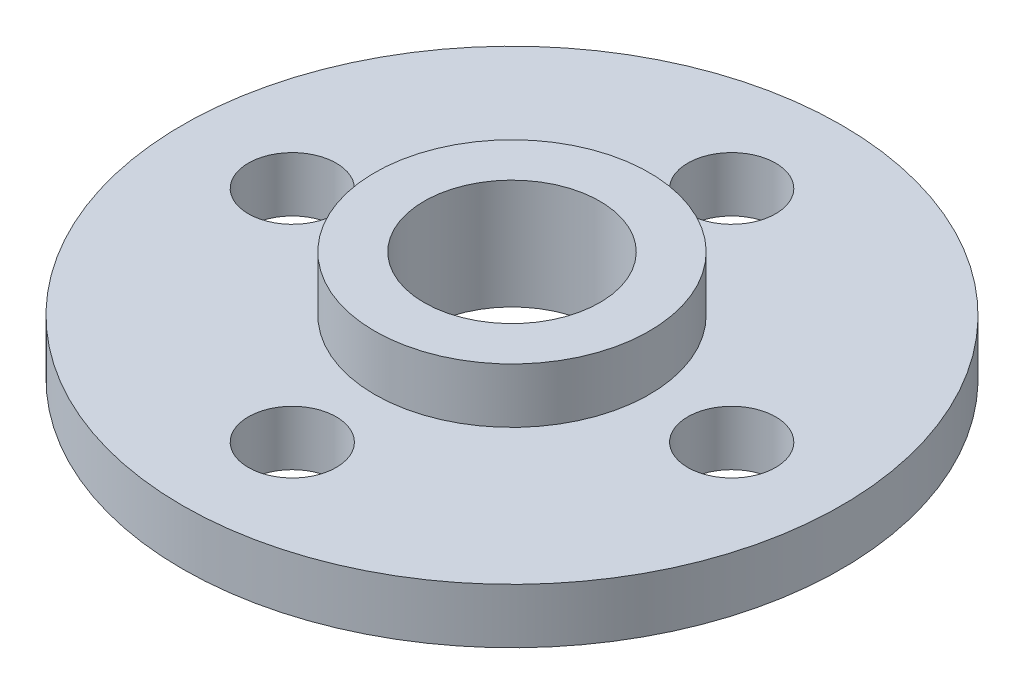
ISO-10303-21;
HEADER;
FILE_DESCRIPTION(('STEP AP214'),'2;1');
FILE_NAME('part.step','',(''),(''),'','','');
FILE_SCHEMA(('AUTOMOTIVE_DESIGN { 1 0 10303 214 1 1 1 1 }'));
ENDSEC;
DATA;
#1=APPLICATION_CONTEXT('core data for automotive mechanical design processes');
#2=APPLICATION_PROTOCOL_DEFINITION('international standard','automotive_design',2000,#1);
#3=PRODUCT_CONTEXT('',#1,'mechanical');
#4=PRODUCT('Part','Part','',(#3));
#5=PRODUCT_RELATED_PRODUCT_CATEGORY('part','',(#4));
#6=PRODUCT_DEFINITION_FORMATION('','',#4);
#7=PRODUCT_DEFINITION_CONTEXT('part definition',#1,'design');
#8=PRODUCT_DEFINITION('design','',#6,#7);
#9=PRODUCT_DEFINITION_SHAPE('','',#8);
#10=(LENGTH_UNIT() NAMED_UNIT(*) SI_UNIT(.MILLI.,.METRE.));
#11=(NAMED_UNIT(*) PLANE_ANGLE_UNIT() SI_UNIT($,.RADIAN.));
#12=(NAMED_UNIT(*) SI_UNIT($,.STERADIAN.) SOLID_ANGLE_UNIT());
#13=UNCERTAINTY_MEASURE_WITH_UNIT(LENGTH_MEASURE(1.E-05),#10,'distance_accuracy_value','');
#14=(GEOMETRIC_REPRESENTATION_CONTEXT(3) GLOBAL_UNCERTAINTY_ASSIGNED_CONTEXT((#13)) GLOBAL_UNIT_ASSIGNED_CONTEXT((#10,
#11,#12)) REPRESENTATION_CONTEXT('',''));
#15=CARTESIAN_POINT('',(0.,0.,0.));
#16=DIRECTION('',(0.,0.,1.));
#17=DIRECTION('',(1.,0.,0.));
#18=AXIS2_PLACEMENT_3D('',#15,#16,#17);
#19=CARTESIAN_POINT('',(0.,5.,0.));
#20=DIRECTION('',(0.,1.,0.));
#21=DIRECTION('',(0.,0.,1.));
#22=AXIS2_PLACEMENT_3D('',#19,#20,#21);
#23=PLANE('',#22);
#24=CARTESIAN_POINT('',(0.,5.,-20.));
#25=DIRECTION('',(0.,1.,0.));
#26=DIRECTION('',(0.,0.,1.));
#27=AXIS2_PLACEMENT_3D('',#24,#25,#26);
#28=CIRCLE('',#27,4.);
#29=CARTESIAN_POINT('',(0.,5.,-16.));
#30=VERTEX_POINT('',#29);
#31=EDGE_CURVE('E92',#30,#30,#28,.T.);
#32=ORIENTED_EDGE('',*,*,#31,.F.);
#33=EDGE_LOOP('',(#32));
#34=FACE_BOUND('',#33,.T.);
#35=CARTESIAN_POINT('',(2.26638887363744E-12,5.,20.));
#36=DIRECTION('',(0.,1.,0.));
#37=DIRECTION('',(0.,0.,1.));
#38=AXIS2_PLACEMENT_3D('',#35,#36,#37);
#39=CIRCLE('',#38,4.0000000000023);
#40=CARTESIAN_POINT('',(2.26638887363744E-12,5.,24.0000000000023));
#41=VERTEX_POINT('',#40);
#42=EDGE_CURVE('E82',#41,#41,#39,.T.);
#43=ORIENTED_EDGE('',*,*,#42,.F.);
#44=EDGE_LOOP('',(#43));
#45=FACE_BOUND('',#44,.T.);
#46=CARTESIAN_POINT('',(0.,5.,0.));
#47=DIRECTION('',(0.,1.,0.));
#48=DIRECTION('',(0.,0.,1.));
#49=AXIS2_PLACEMENT_3D('',#46,#47,#48);
#50=CIRCLE('',#49,30.);
#51=CARTESIAN_POINT('',(0.,5.,30.));
#52=VERTEX_POINT('',#51);
#53=EDGE_CURVE('E11',#52,#52,#50,.T.);
#54=ORIENTED_EDGE('',*,*,#53,.T.);
#55=EDGE_LOOP('',(#54));
#56=FACE_BOUND('',#55,.T.);
#57=CARTESIAN_POINT('',(0.,5.,0.));
#58=DIRECTION('',(0.,1.,0.));
#59=DIRECTION('',(0.,0.,1.));
#60=AXIS2_PLACEMENT_3D('',#57,#58,#59);
#61=CIRCLE('',#60,12.5);
#62=CARTESIAN_POINT('',(0.,5.,12.5));
#63=VERTEX_POINT('',#62);
#64=EDGE_CURVE('E78',#63,#63,#61,.T.);
#65=ORIENTED_EDGE('',*,*,#64,.F.);
#66=EDGE_LOOP('',(#65));
#67=FACE_BOUND('',#66,.T.);
#68=CARTESIAN_POINT('',(20.0000000000011,5.,-1.13319443681872E-12));
#69=DIRECTION('',(0.,1.,0.));
#70=DIRECTION('',(0.,0.,1.));
#71=AXIS2_PLACEMENT_3D('',#68,#69,#70);
#72=CIRCLE('',#71,4.00000000000082);
#73=CARTESIAN_POINT('',(20.0000000000011,5.,3.99999999999969));
#74=VERTEX_POINT('',#73);
#75=EDGE_CURVE('E86',#74,#74,#72,.T.);
#76=ORIENTED_EDGE('',*,*,#75,.F.);
#77=EDGE_LOOP('',(#76));
#78=FACE_BOUND('',#77,.T.);
#79=CARTESIAN_POINT('',(-19.9999999999989,5.,1.13564373041701E-12));
#80=DIRECTION('',(0.,1.,0.));
#81=DIRECTION('',(0.,0.,1.));
#82=AXIS2_PLACEMENT_3D('',#79,#80,#81);
#83=CIRCLE('',#82,4.00000000000162);
#84=CARTESIAN_POINT('',(-19.9999999999989,5.,4.00000000000275));
#85=VERTEX_POINT('',#84);
#86=EDGE_CURVE('E98',#85,#85,#83,.T.);
#87=ORIENTED_EDGE('',*,*,#86,.F.);
#88=EDGE_LOOP('',(#87));
#89=FACE_BOUND('',#88,.T.);
#90=ADVANCED_FACE('F67',(#34,#45,#56,#67,#78,#89),#23,.T.);
#91=CARTESIAN_POINT('',(0.,0.,0.));
#92=DIRECTION('',(0.,1.,0.));
#93=DIRECTION('',(0.,0.,1.));
#94=AXIS2_PLACEMENT_3D('',#91,#92,#93);
#95=PLANE('',#94);
#96=CARTESIAN_POINT('',(0.,0.,0.));
#97=DIRECTION('',(0.,1.,0.));
#98=DIRECTION('',(0.,0.,1.));
#99=AXIS2_PLACEMENT_3D('',#96,#97,#98);
#100=CIRCLE('',#99,30.);
#101=CARTESIAN_POINT('',(0.,0.,30.));
#102=VERTEX_POINT('',#101);
#103=EDGE_CURVE('E71',#102,#102,#100,.T.);
#104=ORIENTED_EDGE('',*,*,#103,.F.);
#105=EDGE_LOOP('',(#104));
#106=FACE_BOUND('',#105,.T.);
#107=CARTESIAN_POINT('',(2.26638887363744E-12,0.,20.));
#108=DIRECTION('',(0.,1.,0.));
#109=DIRECTION('',(0.,0.,1.));
#110=AXIS2_PLACEMENT_3D('',#107,#108,#109);
#111=CIRCLE('',#110,4.0000000000023);
#112=CARTESIAN_POINT('',(2.26638887363744E-12,0.,24.0000000000023));
#113=VERTEX_POINT('',#112);
#114=EDGE_CURVE('E83',#113,#113,#111,.T.);
#115=ORIENTED_EDGE('',*,*,#114,.T.);
#116=EDGE_LOOP('',(#115));
#117=FACE_BOUND('',#116,.T.);
#118=CARTESIAN_POINT('',(20.0000000000011,0.,-1.13319443681872E-12));
#119=DIRECTION('',(0.,1.,0.));
#120=DIRECTION('',(0.,0.,1.));
#121=AXIS2_PLACEMENT_3D('',#118,#119,#120);
#122=CIRCLE('',#121,4.00000000000082);
#123=CARTESIAN_POINT('',(20.0000000000011,0.,3.99999999999969));
#124=VERTEX_POINT('',#123);
#125=EDGE_CURVE('E89',#124,#124,#122,.T.);
#126=ORIENTED_EDGE('',*,*,#125,.T.);
#127=EDGE_LOOP('',(#126));
#128=FACE_BOUND('',#127,.T.);
#129=CARTESIAN_POINT('',(0.,0.,-20.));
#130=DIRECTION('',(0.,1.,0.));
#131=DIRECTION('',(0.,0.,1.));
#132=AXIS2_PLACEMENT_3D('',#129,#130,#131);
#133=CIRCLE('',#132,4.);
#134=CARTESIAN_POINT('',(0.,0.,-16.));
#135=VERTEX_POINT('',#134);
#136=EDGE_CURVE('E95',#135,#135,#133,.T.);
#137=ORIENTED_EDGE('',*,*,#136,.T.);
#138=EDGE_LOOP('',(#137));
#139=FACE_BOUND('',#138,.T.);
#140=CARTESIAN_POINT('',(-19.9999999999989,0.,1.13564373041701E-12));
#141=DIRECTION('',(0.,1.,0.));
#142=DIRECTION('',(0.,0.,1.));
#143=AXIS2_PLACEMENT_3D('',#140,#141,#142);
#144=CIRCLE('',#143,4.00000000000162);
#145=CARTESIAN_POINT('',(-19.9999999999989,0.,4.00000000000275));
#146=VERTEX_POINT('',#145);
#147=EDGE_CURVE('E101',#146,#146,#144,.T.);
#148=ORIENTED_EDGE('',*,*,#147,.T.);
#149=EDGE_LOOP('',(#148));
#150=FACE_BOUND('',#149,.T.);
#151=CARTESIAN_POINT('',(0.,0.,0.));
#152=DIRECTION('',(0.,1.,0.));
#153=DIRECTION('',(0.,0.,1.));
#154=AXIS2_PLACEMENT_3D('',#151,#152,#153);
#155=CIRCLE('',#154,8.);
#156=CARTESIAN_POINT('',(0.,0.,8.));
#157=VERTEX_POINT('',#156);
#158=EDGE_CURVE('E110',#157,#157,#155,.T.);
#159=ORIENTED_EDGE('',*,*,#158,.T.);
#160=EDGE_LOOP('',(#159));
#161=FACE_BOUND('',#160,.T.);
#162=ADVANCED_FACE('F136',(#106,#117,#128,#139,#150,#161),#95,.F.);
#163=CARTESIAN_POINT('',(0.,5.,0.));
#164=DIRECTION('',(0.,-1.,0.));
#165=DIRECTION('',(0.,0.,-1.));
#166=AXIS2_PLACEMENT_3D('',#163,#164,#165);
#167=CYLINDRICAL_SURFACE('',#166,30.);
#168=ORIENTED_EDGE('',*,*,#53,.F.);
#169=EDGE_LOOP('',(#168));
#170=FACE_BOUND('',#169,.T.);
#171=ORIENTED_EDGE('',*,*,#103,.T.);
#172=EDGE_LOOP('',(#171));
#173=FACE_BOUND('',#172,.T.);
#174=ADVANCED_FACE('F69',(#170,#173),#167,.T.);
#175=CARTESIAN_POINT('',(2.26638887363744E-12,5.,20.));
#176=DIRECTION('',(0.,-1.,0.));
#177=DIRECTION('',(0.,0.,-1.));
#178=AXIS2_PLACEMENT_3D('',#175,#176,#177);
#179=CYLINDRICAL_SURFACE('',#178,4.0000000000023);
#180=ORIENTED_EDGE('',*,*,#42,.T.);
#181=EDGE_LOOP('',(#180));
#182=FACE_BOUND('',#181,.T.);
#183=ORIENTED_EDGE('',*,*,#114,.F.);
#184=EDGE_LOOP('',(#183));
#185=FACE_BOUND('',#184,.T.);
#186=ADVANCED_FACE('F146',(#182,#185),#179,.F.);
#187=CARTESIAN_POINT('',(20.0000000000011,5.,-1.13319443681872E-12));
#188=DIRECTION('',(0.,-1.,0.));
#189=DIRECTION('',(0.,0.,-1.));
#190=AXIS2_PLACEMENT_3D('',#187,#188,#189);
#191=CYLINDRICAL_SURFACE('',#190,4.00000000000082);
#192=ORIENTED_EDGE('',*,*,#75,.T.);
#193=EDGE_LOOP('',(#192));
#194=FACE_BOUND('',#193,.T.);
#195=ORIENTED_EDGE('',*,*,#125,.F.);
#196=EDGE_LOOP('',(#195));
#197=FACE_BOUND('',#196,.T.);
#198=ADVANCED_FACE('F149',(#194,#197),#191,.F.);
#199=CARTESIAN_POINT('',(0.,5.,-20.));
#200=DIRECTION('',(0.,-1.,0.));
#201=DIRECTION('',(0.,0.,-1.));
#202=AXIS2_PLACEMENT_3D('',#199,#200,#201);
#203=CYLINDRICAL_SURFACE('',#202,4.);
#204=ORIENTED_EDGE('',*,*,#31,.T.);
#205=EDGE_LOOP('',(#204));
#206=FACE_BOUND('',#205,.T.);
#207=ORIENTED_EDGE('',*,*,#136,.F.);
#208=EDGE_LOOP('',(#207));
#209=FACE_BOUND('',#208,.T.);
#210=ADVANCED_FACE('F131',(#206,#209),#203,.F.);
#211=CARTESIAN_POINT('',(-19.9999999999989,5.,1.13564373041701E-12));
#212=DIRECTION('',(0.,-1.,0.));
#213=DIRECTION('',(0.,0.,-1.));
#214=AXIS2_PLACEMENT_3D('',#211,#212,#213);
#215=CYLINDRICAL_SURFACE('',#214,4.00000000000162);
#216=ORIENTED_EDGE('',*,*,#86,.T.);
#217=EDGE_LOOP('',(#216));
#218=FACE_BOUND('',#217,.T.);
#219=ORIENTED_EDGE('',*,*,#147,.F.);
#220=EDGE_LOOP('',(#219));
#221=FACE_BOUND('',#220,.T.);
#222=ADVANCED_FACE('F122',(#218,#221),#215,.F.);
#223=CARTESIAN_POINT('',(0.,10.,0.));
#224=DIRECTION('',(0.,1.,0.));
#225=DIRECTION('',(0.,0.,1.));
#226=AXIS2_PLACEMENT_3D('',#223,#224,#225);
#227=PLANE('',#226);
#228=CARTESIAN_POINT('',(0.,10.,0.));
#229=DIRECTION('',(0.,1.,0.));
#230=DIRECTION('',(0.,0.,1.));
#231=AXIS2_PLACEMENT_3D('',#228,#229,#230);
#232=CIRCLE('',#231,12.5);
#233=CARTESIAN_POINT('',(0.,10.,12.5));
#234=VERTEX_POINT('',#233);
#235=EDGE_CURVE('E104',#234,#234,#232,.T.);
#236=ORIENTED_EDGE('',*,*,#235,.T.);
#237=EDGE_LOOP('',(#236));
#238=FACE_BOUND('',#237,.T.);
#239=CARTESIAN_POINT('',(0.,10.,0.));
#240=DIRECTION('',(0.,1.,0.));
#241=DIRECTION('',(0.,0.,1.));
#242=AXIS2_PLACEMENT_3D('',#239,#240,#241);
#243=CIRCLE('',#242,8.);
#244=CARTESIAN_POINT('',(0.,10.,8.));
#245=VERTEX_POINT('',#244);
#246=EDGE_CURVE('E109',#245,#245,#243,.T.);
#247=ORIENTED_EDGE('',*,*,#246,.F.);
#248=EDGE_LOOP('',(#247));
#249=FACE_BOUND('',#248,.T.);
#250=ADVANCED_FACE('F119',(#238,#249),#227,.T.);
#251=CARTESIAN_POINT('',(0.,10.,0.));
#252=DIRECTION('',(0.,-1.,0.));
#253=DIRECTION('',(0.,0.,-1.));
#254=AXIS2_PLACEMENT_3D('',#251,#252,#253);
#255=CYLINDRICAL_SURFACE('',#254,12.5);
#256=ORIENTED_EDGE('',*,*,#64,.T.);
#257=EDGE_LOOP('',(#256));
#258=FACE_BOUND('',#257,.T.);
#259=ORIENTED_EDGE('',*,*,#235,.F.);
#260=EDGE_LOOP('',(#259));
#261=FACE_BOUND('',#260,.T.);
#262=ADVANCED_FACE('F121',(#258,#261),#255,.T.);
#263=CARTESIAN_POINT('',(0.,10.,0.));
#264=DIRECTION('',(0.,-1.,0.));
#265=DIRECTION('',(0.,0.,-1.));
#266=AXIS2_PLACEMENT_3D('',#263,#264,#265);
#267=CYLINDRICAL_SURFACE('',#266,8.);
#268=ORIENTED_EDGE('',*,*,#246,.T.);
#269=EDGE_LOOP('',(#268));
#270=FACE_BOUND('',#269,.T.);
#271=ORIENTED_EDGE('',*,*,#158,.F.);
#272=EDGE_LOOP('',(#271));
#273=FACE_BOUND('',#272,.T.);
#274=ADVANCED_FACE('F116',(#270,#273),#267,.F.);
#275=CLOSED_SHELL('',(#90,#162,#174,#186,#198,#210,#222,#250,#262,#274));
#276=MANIFOLD_SOLID_BREP('B2',#275);
#277=ADVANCED_BREP_SHAPE_REPRESENTATION('',(#18,#276),#14);
#278=SHAPE_DEFINITION_REPRESENTATION(#9,#277);
ENDSEC;
END-ISO-10303-21;
